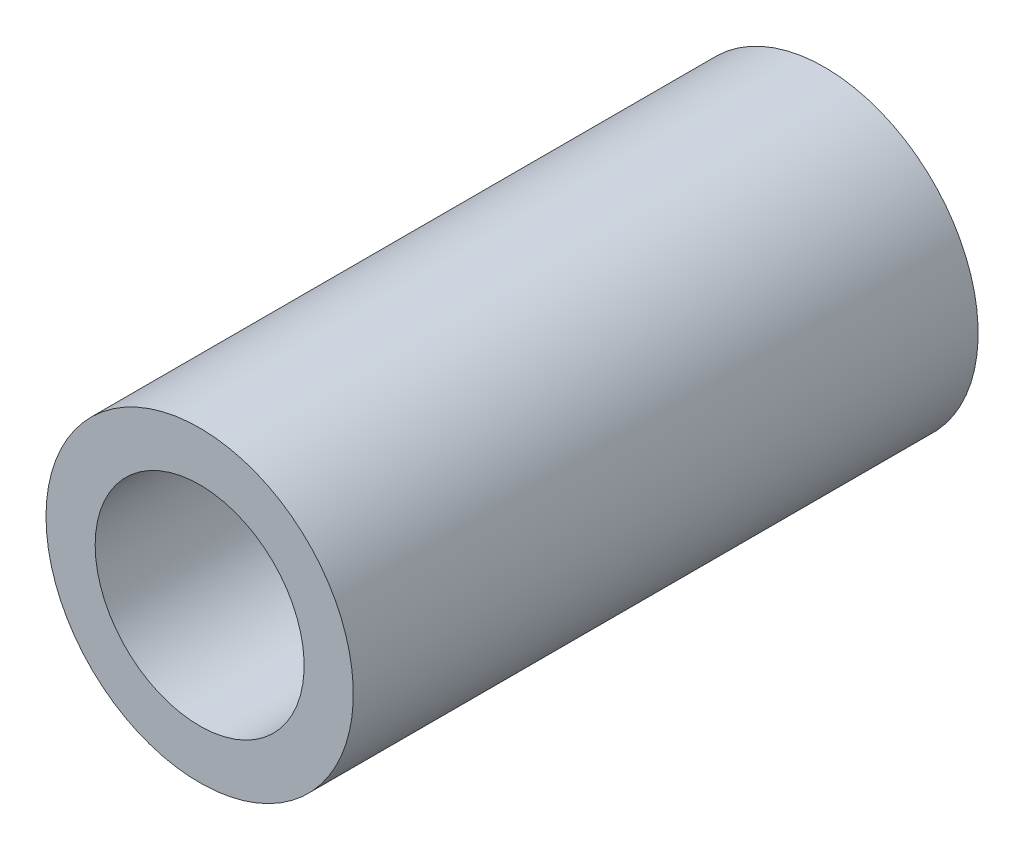
ISO-10303-21;
HEADER;
FILE_DESCRIPTION(('STEP AP214'),'2;1');
FILE_NAME('part.step','',(''),(''),'','','');
FILE_SCHEMA(('AUTOMOTIVE_DESIGN { 1 0 10303 214 1 1 1 1 }'));
ENDSEC;
DATA;
#1=APPLICATION_CONTEXT('core data for automotive mechanical design processes');
#2=APPLICATION_PROTOCOL_DEFINITION('international standard','automotive_design',2000,#1);
#3=PRODUCT_CONTEXT('',#1,'mechanical');
#4=PRODUCT('Part','Part','',(#3));
#5=PRODUCT_RELATED_PRODUCT_CATEGORY('part','',(#4));
#6=PRODUCT_DEFINITION_FORMATION('','',#4);
#7=PRODUCT_DEFINITION_CONTEXT('part definition',#1,'design');
#8=PRODUCT_DEFINITION('design','',#6,#7);
#9=PRODUCT_DEFINITION_SHAPE('','',#8);
#10=(LENGTH_UNIT() NAMED_UNIT(*) SI_UNIT(.MILLI.,.METRE.));
#11=(NAMED_UNIT(*) PLANE_ANGLE_UNIT() SI_UNIT($,.RADIAN.));
#12=(NAMED_UNIT(*) SI_UNIT($,.STERADIAN.) SOLID_ANGLE_UNIT());
#13=UNCERTAINTY_MEASURE_WITH_UNIT(LENGTH_MEASURE(1.E-05),#10,'distance_accuracy_value','');
#14=(GEOMETRIC_REPRESENTATION_CONTEXT(3) GLOBAL_UNCERTAINTY_ASSIGNED_CONTEXT((#13)) GLOBAL_UNIT_ASSIGNED_CONTEXT((#10,
#11,#12)) REPRESENTATION_CONTEXT('',''));
#15=CARTESIAN_POINT('',(0.,0.,0.));
#16=DIRECTION('',(0.,0.,1.));
#17=DIRECTION('',(1.,0.,0.));
#18=AXIS2_PLACEMENT_3D('',#15,#16,#17);
#19=CARTESIAN_POINT('',(0.,0.,30.5));
#20=DIRECTION('',(0.,0.,1.));
#21=DIRECTION('',(1.,0.,0.));
#22=AXIS2_PLACEMENT_3D('',#19,#20,#21);
#23=PLANE('',#22);
#24=CARTESIAN_POINT('',(0.,0.,30.5));
#25=DIRECTION('',(0.,0.,1.));
#26=DIRECTION('',(1.,0.,0.));
#27=AXIS2_PLACEMENT_3D('',#24,#25,#26);
#28=CIRCLE('',#27,7.5);
#29=CARTESIAN_POINT('',(-7.5,0.,30.5));
#30=VERTEX_POINT('',#29);
#31=EDGE_CURVE('E10',#30,#30,#28,.T.);
#32=ORIENTED_EDGE('',*,*,#31,.T.);
#33=EDGE_LOOP('',(#32));
#34=FACE_BOUND('',#33,.T.);
#35=CARTESIAN_POINT('',(0.,0.,30.5));
#36=DIRECTION('',(0.,0.,1.));
#37=DIRECTION('',(1.,0.,0.));
#38=AXIS2_PLACEMENT_3D('',#35,#36,#37);
#39=CIRCLE('',#38,5.1);
#40=CARTESIAN_POINT('',(-5.1,0.,30.5));
#41=VERTEX_POINT('',#40);
#42=EDGE_CURVE('E44',#41,#41,#39,.T.);
#43=ORIENTED_EDGE('',*,*,#42,.F.);
#44=EDGE_LOOP('',(#43));
#45=FACE_BOUND('',#44,.T.);
#46=ADVANCED_FACE('F33',(#34,#45),#23,.T.);
#47=CARTESIAN_POINT('',(0.,0.,0.));
#48=DIRECTION('',(0.,0.,1.));
#49=DIRECTION('',(1.,0.,0.));
#50=AXIS2_PLACEMENT_3D('',#47,#48,#49);
#51=PLANE('',#50);
#52=CARTESIAN_POINT('',(0.,0.,0.));
#53=DIRECTION('',(0.,0.,1.));
#54=DIRECTION('',(1.,0.,0.));
#55=AXIS2_PLACEMENT_3D('',#52,#53,#54);
#56=CIRCLE('',#55,7.5);
#57=CARTESIAN_POINT('',(-7.5,0.,0.));
#58=VERTEX_POINT('',#57);
#59=EDGE_CURVE('E37',#58,#58,#56,.T.);
#60=ORIENTED_EDGE('',*,*,#59,.F.);
#61=EDGE_LOOP('',(#60));
#62=FACE_BOUND('',#61,.T.);
#63=CARTESIAN_POINT('',(0.,0.,0.));
#64=DIRECTION('',(0.,0.,1.));
#65=DIRECTION('',(1.,0.,0.));
#66=AXIS2_PLACEMENT_3D('',#63,#64,#65);
#67=CIRCLE('',#66,5.1);
#68=CARTESIAN_POINT('',(-5.1,0.,0.));
#69=VERTEX_POINT('',#68);
#70=EDGE_CURVE('E46',#69,#69,#67,.T.);
#71=ORIENTED_EDGE('',*,*,#70,.T.);
#72=EDGE_LOOP('',(#71));
#73=FACE_BOUND('',#72,.T.);
#74=ADVANCED_FACE('F56',(#62,#73),#51,.F.);
#75=CARTESIAN_POINT('',(0.,0.,30.5));
#76=DIRECTION('',(0.,0.,-1.));
#77=DIRECTION('',(-1.,0.,0.));
#78=AXIS2_PLACEMENT_3D('',#75,#76,#77);
#79=CYLINDRICAL_SURFACE('',#78,7.5);
#80=CARTESIAN_POINT('',(-7.5,0.,30.5));
#81=CARTESIAN_POINT('',(-7.5,0.,30.1822916666667));
#82=CARTESIAN_POINT('',(-7.5,0.,29.8645833333333));
#83=CARTESIAN_POINT('',(-7.5,0.,29.2291666666667));
#84=CARTESIAN_POINT('',(-7.5,0.,28.9114583333333));
#85=CARTESIAN_POINT('',(-7.5,0.,28.2760416666667));
#86=CARTESIAN_POINT('',(-7.5,0.,27.9583333333333));
#87=CARTESIAN_POINT('',(-7.5,0.,27.3229166666667));
#88=CARTESIAN_POINT('',(-7.5,0.,27.0052083333333));
#89=CARTESIAN_POINT('',(-7.5,0.,26.3697916666667));
#90=CARTESIAN_POINT('',(-7.5,0.,26.0520833333333));
#91=CARTESIAN_POINT('',(-7.5,0.,25.4166666666667));
#92=CARTESIAN_POINT('',(-7.5,0.,25.0989583333333));
#93=CARTESIAN_POINT('',(-7.5,0.,24.4635416666667));
#94=CARTESIAN_POINT('',(-7.5,0.,24.1458333333333));
#95=CARTESIAN_POINT('',(-7.5,0.,23.5104166666667));
#96=CARTESIAN_POINT('',(-7.5,0.,23.1927083333333));
#97=CARTESIAN_POINT('',(-7.5,0.,22.5572916666667));
#98=CARTESIAN_POINT('',(-7.5,0.,22.2395833333333));
#99=CARTESIAN_POINT('',(-7.5,0.,21.6041666666667));
#100=CARTESIAN_POINT('',(-7.5,0.,21.2864583333333));
#101=CARTESIAN_POINT('',(-7.5,0.,20.6510416666667));
#102=CARTESIAN_POINT('',(-7.5,0.,20.3333333333333));
#103=CARTESIAN_POINT('',(-7.5,0.,19.6979166666667));
#104=CARTESIAN_POINT('',(-7.5,0.,19.3802083333333));
#105=CARTESIAN_POINT('',(-7.5,0.,18.7447916666667));
#106=CARTESIAN_POINT('',(-7.5,0.,18.4270833333333));
#107=CARTESIAN_POINT('',(-7.5,0.,17.7916666666667));
#108=CARTESIAN_POINT('',(-7.5,0.,17.4739583333333));
#109=CARTESIAN_POINT('',(-7.5,0.,16.8385416666667));
#110=CARTESIAN_POINT('',(-7.5,0.,16.5208333333333));
#111=CARTESIAN_POINT('',(-7.5,0.,15.8854166666667));
#112=CARTESIAN_POINT('',(-7.5,0.,15.5677083333333));
#113=CARTESIAN_POINT('',(-7.5,0.,14.9322916666667));
#114=CARTESIAN_POINT('',(-7.5,0.,14.6145833333333));
#115=CARTESIAN_POINT('',(-7.5,0.,13.9791666666667));
#116=CARTESIAN_POINT('',(-7.5,0.,13.6614583333333));
#117=CARTESIAN_POINT('',(-7.5,0.,13.0260416666667));
#118=CARTESIAN_POINT('',(-7.5,0.,12.7083333333333));
#119=CARTESIAN_POINT('',(-7.5,0.,12.0729166666667));
#120=CARTESIAN_POINT('',(-7.5,0.,11.7552083333333));
#121=CARTESIAN_POINT('',(-7.5,0.,11.1197916666667));
#122=CARTESIAN_POINT('',(-7.5,0.,10.8020833333333));
#123=CARTESIAN_POINT('',(-7.5,0.,10.1666666666667));
#124=CARTESIAN_POINT('',(-7.5,0.,9.84895833333333));
#125=CARTESIAN_POINT('',(-7.5,0.,9.21354166666666));
#126=CARTESIAN_POINT('',(-7.5,0.,8.89583333333333));
#127=CARTESIAN_POINT('',(-7.5,0.,8.26041666666666));
#128=CARTESIAN_POINT('',(-7.5,0.,7.94270833333333));
#129=CARTESIAN_POINT('',(-7.5,0.,7.30729166666666));
#130=CARTESIAN_POINT('',(-7.5,0.,6.98958333333333));
#131=CARTESIAN_POINT('',(-7.5,0.,6.35416666666666));
#132=CARTESIAN_POINT('',(-7.5,0.,6.03645833333333));
#133=CARTESIAN_POINT('',(-7.5,0.,5.40104166666666));
#134=CARTESIAN_POINT('',(-7.5,0.,5.08333333333333));
#135=CARTESIAN_POINT('',(-7.5,0.,4.44791666666666));
#136=CARTESIAN_POINT('',(-7.5,0.,4.13020833333333));
#137=CARTESIAN_POINT('',(-7.5,0.,3.49479166666666));
#138=CARTESIAN_POINT('',(-7.5,0.,3.17708333333333));
#139=CARTESIAN_POINT('',(-7.5,0.,2.54166666666666));
#140=CARTESIAN_POINT('',(-7.5,0.,2.22395833333333));
#141=CARTESIAN_POINT('',(-7.5,0.,1.58854166666666));
#142=CARTESIAN_POINT('',(-7.5,0.,1.27083333333333));
#143=CARTESIAN_POINT('',(-7.5,0.,0.635416666666662));
#144=CARTESIAN_POINT('',(-7.5,0.,0.317708333333329));
#145=CARTESIAN_POINT('',(-7.5,0.,0.));
#146=B_SPLINE_CURVE_WITH_KNOTS('',3,(#80,#81,#82,#83,#84,#85,#86,#87,#88,#89,#90,#91,#92,#93,
#94,#95,#96,#97,#98,#99,#100,#101,#102,#103,#104,#105,#106,#107,#108,#109,#110,#111,#112,#113,
#114,#115,#116,#117,#118,#119,#120,#121,#122,#123,#124,#125,#126,#127,#128,#129,#130,#131,#132,
#133,#134,#135,#136,#137,#138,#139,#140,#141,#142,#143,#144,#145),.UNSPECIFIED.,.F.,.F.,(4,2,2,
2,2,2,2,2,2,2,2,2,2,2,2,2,2,2,2,2,2,2,2,2,2,2,2,2,2,2,2,2,4),(0.,0.953124999999999,1.90625,
2.859375,3.8125,4.765625,5.71875,6.671875,7.625,8.57812499999999,9.53125,10.484375,11.4375,
12.390625,13.34375,14.296875,15.25,16.203125,17.15625,18.109375,19.0625,20.015625,20.96875,
21.921875,22.875,23.828125,24.78125,25.734375,26.6875,27.640625,28.59375,29.546875,30.5),.UNSPECIFIED.);
#147=EDGE_CURVE('BSEAM35',#30,#58,#146,.T.);
#148=ORIENTED_EDGE('',*,*,#31,.F.);
#149=ORIENTED_EDGE('',*,*,#59,.T.);
#150=ORIENTED_EDGE('',*,*,#147,.T.);
#151=ORIENTED_EDGE('',*,*,#147,.F.);
#152=EDGE_LOOP('',(#148,#150,#149,#151));
#153=FACE_BOUND('',#152,.T.);
#154=ADVANCED_FACE('F35',(#153),#79,.T.);
#155=CARTESIAN_POINT('',(0.,0.,30.5));
#156=DIRECTION('',(0.,0.,-1.));
#157=DIRECTION('',(-1.,0.,0.));
#158=AXIS2_PLACEMENT_3D('',#155,#156,#157);
#159=CYLINDRICAL_SURFACE('',#158,5.1);
#160=CARTESIAN_POINT('',(-5.1,0.,30.5));
#161=CARTESIAN_POINT('',(-5.1,0.,30.1822916666667));
#162=CARTESIAN_POINT('',(-5.1,0.,29.8645833333333));
#163=CARTESIAN_POINT('',(-5.1,0.,29.2291666666667));
#164=CARTESIAN_POINT('',(-5.1,0.,28.9114583333333));
#165=CARTESIAN_POINT('',(-5.1,0.,28.2760416666667));
#166=CARTESIAN_POINT('',(-5.1,0.,27.9583333333333));
#167=CARTESIAN_POINT('',(-5.1,0.,27.3229166666667));
#168=CARTESIAN_POINT('',(-5.1,0.,27.0052083333333));
#169=CARTESIAN_POINT('',(-5.1,0.,26.3697916666667));
#170=CARTESIAN_POINT('',(-5.1,0.,26.0520833333333));
#171=CARTESIAN_POINT('',(-5.1,0.,25.4166666666667));
#172=CARTESIAN_POINT('',(-5.1,0.,25.0989583333333));
#173=CARTESIAN_POINT('',(-5.1,0.,24.4635416666667));
#174=CARTESIAN_POINT('',(-5.1,0.,24.1458333333333));
#175=CARTESIAN_POINT('',(-5.1,0.,23.5104166666667));
#176=CARTESIAN_POINT('',(-5.1,0.,23.1927083333333));
#177=CARTESIAN_POINT('',(-5.1,0.,22.5572916666667));
#178=CARTESIAN_POINT('',(-5.1,0.,22.2395833333333));
#179=CARTESIAN_POINT('',(-5.1,0.,21.6041666666667));
#180=CARTESIAN_POINT('',(-5.1,0.,21.2864583333333));
#181=CARTESIAN_POINT('',(-5.1,0.,20.6510416666667));
#182=CARTESIAN_POINT('',(-5.1,0.,20.3333333333333));
#183=CARTESIAN_POINT('',(-5.1,0.,19.6979166666667));
#184=CARTESIAN_POINT('',(-5.1,0.,19.3802083333333));
#185=CARTESIAN_POINT('',(-5.1,0.,18.7447916666667));
#186=CARTESIAN_POINT('',(-5.1,0.,18.4270833333333));
#187=CARTESIAN_POINT('',(-5.1,0.,17.7916666666667));
#188=CARTESIAN_POINT('',(-5.1,0.,17.4739583333333));
#189=CARTESIAN_POINT('',(-5.1,0.,16.8385416666667));
#190=CARTESIAN_POINT('',(-5.1,0.,16.5208333333333));
#191=CARTESIAN_POINT('',(-5.1,0.,15.8854166666667));
#192=CARTESIAN_POINT('',(-5.1,0.,15.5677083333333));
#193=CARTESIAN_POINT('',(-5.1,0.,14.9322916666667));
#194=CARTESIAN_POINT('',(-5.1,0.,14.6145833333333));
#195=CARTESIAN_POINT('',(-5.1,0.,13.9791666666667));
#196=CARTESIAN_POINT('',(-5.1,0.,13.6614583333333));
#197=CARTESIAN_POINT('',(-5.1,0.,13.0260416666667));
#198=CARTESIAN_POINT('',(-5.1,0.,12.7083333333333));
#199=CARTESIAN_POINT('',(-5.1,0.,12.0729166666667));
#200=CARTESIAN_POINT('',(-5.1,0.,11.7552083333333));
#201=CARTESIAN_POINT('',(-5.1,0.,11.1197916666667));
#202=CARTESIAN_POINT('',(-5.1,0.,10.8020833333333));
#203=CARTESIAN_POINT('',(-5.1,0.,10.1666666666667));
#204=CARTESIAN_POINT('',(-5.1,0.,9.84895833333333));
#205=CARTESIAN_POINT('',(-5.1,0.,9.21354166666666));
#206=CARTESIAN_POINT('',(-5.1,0.,8.89583333333333));
#207=CARTESIAN_POINT('',(-5.1,0.,8.26041666666666));
#208=CARTESIAN_POINT('',(-5.1,0.,7.94270833333333));
#209=CARTESIAN_POINT('',(-5.1,0.,7.30729166666666));
#210=CARTESIAN_POINT('',(-5.1,0.,6.98958333333333));
#211=CARTESIAN_POINT('',(-5.1,0.,6.35416666666666));
#212=CARTESIAN_POINT('',(-5.1,0.,6.03645833333333));
#213=CARTESIAN_POINT('',(-5.1,0.,5.40104166666667));
#214=CARTESIAN_POINT('',(-5.1,0.,5.08333333333333));
#215=CARTESIAN_POINT('',(-5.1,0.,4.44791666666667));
#216=CARTESIAN_POINT('',(-5.1,0.,4.13020833333333));
#217=CARTESIAN_POINT('',(-5.1,0.,3.49479166666666));
#218=CARTESIAN_POINT('',(-5.1,0.,3.17708333333333));
#219=CARTESIAN_POINT('',(-5.1,0.,2.54166666666666));
#220=CARTESIAN_POINT('',(-5.1,0.,2.22395833333333));
#221=CARTESIAN_POINT('',(-5.1,0.,1.58854166666666));
#222=CARTESIAN_POINT('',(-5.1,0.,1.27083333333333));
#223=CARTESIAN_POINT('',(-5.1,0.,0.635416666666662));
#224=CARTESIAN_POINT('',(-5.1,0.,0.317708333333329));
#225=CARTESIAN_POINT('',(-5.1,0.,0.));
#226=B_SPLINE_CURVE_WITH_KNOTS('',3,(#160,#161,#162,#163,#164,#165,#166,#167,#168,#169,#170,
#171,#172,#173,#174,#175,#176,#177,#178,#179,#180,#181,#182,#183,#184,#185,#186,#187,#188,#189,
#190,#191,#192,#193,#194,#195,#196,#197,#198,#199,#200,#201,#202,#203,#204,#205,#206,#207,#208,
#209,#210,#211,#212,#213,#214,#215,#216,#217,#218,#219,#220,#221,#222,#223,#224,#225),
.UNSPECIFIED.,.F.,.F.,(4,2,2,2,2,2,2,2,2,2,2,2,2,2,2,2,2,2,2,2,2,2,2,2,2,2,2,2,2,2,2,2,4),(0.,
0.953125000000003,1.90625,2.859375,3.8125,4.765625,5.71875,6.671875,7.625,8.578125,9.53125,
10.484375,11.4375,12.390625,13.34375,14.296875,15.25,16.203125,17.15625,18.109375,19.0625,
20.015625,20.96875,21.921875,22.875,23.828125,24.78125,25.734375,26.6875,27.640625,28.59375,
29.546875,30.5),.UNSPECIFIED.);
#227=EDGE_CURVE('BSEAM52',#41,#69,#226,.T.);
#228=ORIENTED_EDGE('',*,*,#42,.T.);
#229=ORIENTED_EDGE('',*,*,#70,.F.);
#230=ORIENTED_EDGE('',*,*,#227,.T.);
#231=ORIENTED_EDGE('',*,*,#227,.F.);
#232=EDGE_LOOP('',(#228,#230,#229,#231));
#233=FACE_BOUND('',#232,.T.);
#234=ADVANCED_FACE('F52',(#233),#159,.F.);
#235=CLOSED_SHELL('',(#46,#74,#154,#234));
#236=MANIFOLD_SOLID_BREP('B2',#235);
#237=ADVANCED_BREP_SHAPE_REPRESENTATION('',(#18,#236),#14);
#238=SHAPE_DEFINITION_REPRESENTATION(#9,#237);
ENDSEC;
END-ISO-10303-21;
